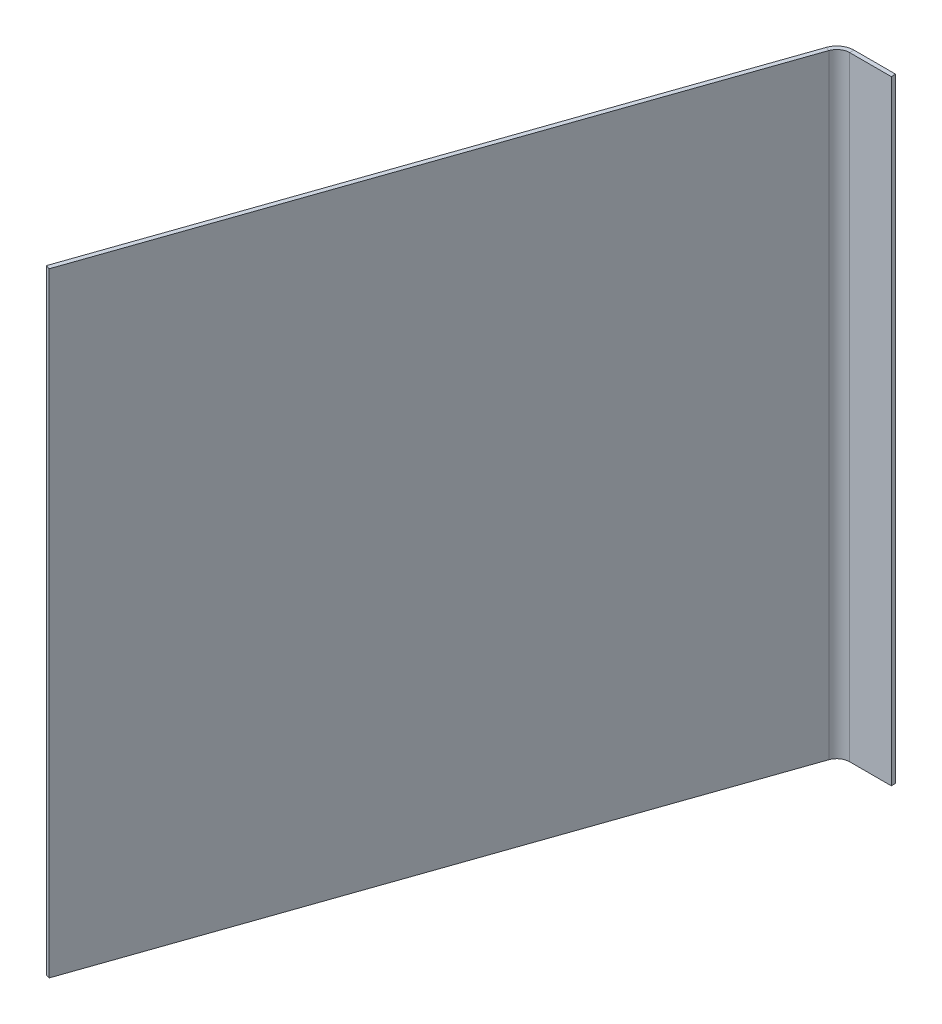
ISO-10303-21;
HEADER;
FILE_DESCRIPTION(('STEP AP214'),'2;1');
FILE_NAME('part.step','',(''),(''),'','','');
FILE_SCHEMA(('AUTOMOTIVE_DESIGN { 1 0 10303 214 1 1 1 1 }'));
ENDSEC;
DATA;
#1=APPLICATION_CONTEXT('core data for automotive mechanical design processes');
#2=APPLICATION_PROTOCOL_DEFINITION('international standard','automotive_design',2000,#1);
#3=PRODUCT_CONTEXT('',#1,'mechanical');
#4=PRODUCT('Part','Part','',(#3));
#5=PRODUCT_RELATED_PRODUCT_CATEGORY('part','',(#4));
#6=PRODUCT_DEFINITION_FORMATION('','',#4);
#7=PRODUCT_DEFINITION_CONTEXT('part definition',#1,'design');
#8=PRODUCT_DEFINITION('design','',#6,#7);
#9=PRODUCT_DEFINITION_SHAPE('','',#8);
#10=(LENGTH_UNIT() NAMED_UNIT(*) SI_UNIT(.MILLI.,.METRE.));
#11=(NAMED_UNIT(*) PLANE_ANGLE_UNIT() SI_UNIT($,.RADIAN.));
#12=(NAMED_UNIT(*) SI_UNIT($,.STERADIAN.) SOLID_ANGLE_UNIT());
#13=UNCERTAINTY_MEASURE_WITH_UNIT(LENGTH_MEASURE(1.E-05),#10,'distance_accuracy_value','');
#14=(GEOMETRIC_REPRESENTATION_CONTEXT(3) GLOBAL_UNCERTAINTY_ASSIGNED_CONTEXT((#13)) GLOBAL_UNIT_ASSIGNED_CONTEXT((#10,
#11,#12)) REPRESENTATION_CONTEXT('',''));
#15=CARTESIAN_POINT('',(0.,0.,0.));
#16=DIRECTION('',(0.,0.,1.));
#17=DIRECTION('',(1.,0.,0.));
#18=AXIS2_PLACEMENT_3D('',#15,#16,#17);
#19=CARTESIAN_POINT('',(46.0338007866481,285.,-201.623025639547));
#20=DIRECTION('',(0.,1.,0.));
#21=DIRECTION('',(0.,0.,1.));
#22=AXIS2_PLACEMENT_3D('',#19,#20,#21);
#23=PLANE('',#22);
#24=DIRECTION('',(0.,0.,1.));
#25=VECTOR('',#24,1.);
#26=CARTESIAN_POINT('',(46.0338007866481,285.,-201.623025639547));
#27=LINE('',#26,#25);
#28=CARTESIAN_POINT('',(46.0338007866481,285.,-201.623025639547));
#29=VERTEX_POINT('',#28);
#30=CARTESIAN_POINT('',(46.0338007866481,285.,-199.623025639547));
#31=VERTEX_POINT('',#30);
#32=EDGE_CURVE('E11',#29,#31,#27,.T.);
#33=ORIENTED_EDGE('',*,*,#32,.F.);
#34=CARTESIAN_POINT('',(46.0338007866481,285.,-193.623025639546));
#35=DIRECTION('',(0.,1.,0.));
#36=DIRECTION('',(0.,0.,1.));
#37=AXIS2_PLACEMENT_3D('',#34,#35,#36);
#38=CIRCLE('',#37,8.);
#39=CARTESIAN_POINT('',(38.4759660145645,285.,-196.245835880087));
#40=VERTEX_POINT('',#39);
#41=EDGE_CURVE('E143',#40,#29,#38,.F.);
#42=ORIENTED_EDGE('',*,*,#41,.F.);
#43=DIRECTION('',(-0.944729346510452,0.,-0.327851280067556));
#44=VECTOR('',#43,1.);
#45=CARTESIAN_POINT('',(40.3654247075854,285.,-195.590133319952));
#46=LINE('',#45,#44);
#47=CARTESIAN_POINT('',(40.3654247075854,285.,-195.590133319952));
#48=VERTEX_POINT('',#47);
#49=EDGE_CURVE('E49',#48,#40,#46,.T.);
#50=ORIENTED_EDGE('',*,*,#49,.F.);
#51=CARTESIAN_POINT('',(46.0338007866481,285.,-193.623025639546));
#52=DIRECTION('',(0.,1.,0.));
#53=DIRECTION('',(1.,0.,0.));
#54=AXIS2_PLACEMENT_3D('',#51,#52,#53);
#55=CIRCLE('',#54,6.);
#56=EDGE_CURVE('E133',#48,#31,#55,.F.);
#57=ORIENTED_EDGE('',*,*,#56,.T.);
#58=EDGE_LOOP('',(#33,#42,#50,#57));
#59=FACE_BOUND('',#58,.T.);
#60=ADVANCED_FACE('F40',(#59),#23,.T.);
#61=CARTESIAN_POINT('',(40.3654247075854,285.,-195.590133319952));
#62=DIRECTION('',(0.,1.,0.));
#63=DIRECTION('',(0.,0.,1.));
#64=AXIS2_PLACEMENT_3D('',#61,#62,#63);
#65=PLANE('',#64);
#66=DIRECTION('',(1.,0.,0.));
#67=VECTOR('',#66,1.);
#68=CARTESIAN_POINT('',(40.3420227347422,285.,-201.623025639547));
#69=LINE('',#68,#67);
#70=CARTESIAN_POINT('',(65.3420227347423,285.,-201.623025639547));
#71=VERTEX_POINT('',#70);
#72=EDGE_CURVE('E213',#29,#71,#69,.T.);
#73=ORIENTED_EDGE('',*,*,#72,.F.);
#74=ORIENTED_EDGE('',*,*,#32,.T.);
#75=DIRECTION('',(1.,0.,0.));
#76=VECTOR('',#75,1.);
#77=CARTESIAN_POINT('',(40.3420227347423,285.,-199.623025639546));
#78=LINE('',#77,#76);
#79=CARTESIAN_POINT('',(65.3420227347423,285.,-199.623025639547));
#80=VERTEX_POINT('',#79);
#81=EDGE_CURVE('E97',#31,#80,#78,.T.);
#82=ORIENTED_EDGE('',*,*,#81,.T.);
#83=DIRECTION('',(0.,0.,1.));
#84=VECTOR('',#83,1.);
#85=CARTESIAN_POINT('',(65.3420227347423,285.,-201.623025639547));
#86=LINE('',#85,#84);
#87=EDGE_CURVE('E399',#71,#80,#86,.T.);
#88=ORIENTED_EDGE('',*,*,#87,.F.);
#89=EDGE_LOOP('',(#73,#74,#82,#88));
#90=FACE_BOUND('',#89,.T.);
#91=ADVANCED_FACE('F221',(#90),#65,.T.);
#92=CARTESIAN_POINT('',(38.4759660145645,0.,-196.245835880087));
#93=DIRECTION('',(0.,-1.,0.));
#94=DIRECTION('',(0.,0.,-1.));
#95=AXIS2_PLACEMENT_3D('',#92,#93,#94);
#96=PLANE('',#95);
#97=DIRECTION('',(0.944729346510452,0.,0.327851280067556));
#98=VECTOR('',#97,1.);
#99=CARTESIAN_POINT('',(38.4759660145645,0.,-196.245835880087));
#100=LINE('',#99,#98);
#101=CARTESIAN_POINT('',(38.4759660145645,0.,-196.245835880087));
#102=VERTEX_POINT('',#101);
#103=CARTESIAN_POINT('',(40.3654247075854,0.,-195.590133319952));
#104=VERTEX_POINT('',#103);
#105=EDGE_CURVE('E84',#102,#104,#100,.T.);
#106=ORIENTED_EDGE('',*,*,#105,.F.);
#107=CARTESIAN_POINT('',(46.0338007866481,0.,-193.623025639547));
#108=DIRECTION('',(0.,1.,0.));
#109=DIRECTION('',(0.,0.,1.));
#110=AXIS2_PLACEMENT_3D('',#107,#108,#109);
#111=CIRCLE('',#110,8.);
#112=CARTESIAN_POINT('',(46.0338007866481,0.,-201.623025639547));
#113=VERTEX_POINT('',#112);
#114=EDGE_CURVE('E162',#102,#113,#111,.F.);
#115=ORIENTED_EDGE('',*,*,#114,.T.);
#116=DIRECTION('',(0.,0.,-1.));
#117=VECTOR('',#116,1.);
#118=CARTESIAN_POINT('',(46.0338007866481,0.,-199.623025639547));
#119=LINE('',#118,#117);
#120=CARTESIAN_POINT('',(46.0338007866481,0.,-199.623025639547));
#121=VERTEX_POINT('',#120);
#122=EDGE_CURVE('E91',#121,#113,#119,.T.);
#123=ORIENTED_EDGE('',*,*,#122,.F.);
#124=CARTESIAN_POINT('',(46.0338007866481,0.,-193.623025639547));
#125=DIRECTION('',(0.,1.,0.));
#126=DIRECTION('',(1.,0.,0.));
#127=AXIS2_PLACEMENT_3D('',#124,#125,#126);
#128=CIRCLE('',#127,6.);
#129=EDGE_CURVE('E173',#104,#121,#128,.F.);
#130=ORIENTED_EDGE('',*,*,#129,.F.);
#131=EDGE_LOOP('',(#106,#115,#123,#130));
#132=FACE_BOUND('',#131,.T.);
#133=ADVANCED_FACE('F219',(#132),#96,.T.);
#134=CARTESIAN_POINT('',(46.0338007866481,0.,-199.623025639547));
#135=DIRECTION('',(0.,-1.,0.));
#136=DIRECTION('',(0.,0.,-1.));
#137=AXIS2_PLACEMENT_3D('',#134,#135,#136);
#138=PLANE('',#137);
#139=DIRECTION('',(0.327851280067554,0.,-0.944729346510452));
#140=VECTOR('',#139,1.);
#141=CARTESIAN_POINT('',(-54.7348484848486,0.,72.3484848484841));
#142=LINE('',#141,#140);
#143=CARTESIAN_POINT('',(-54.7348484848486,0.,72.3484848484841));
#144=VERTEX_POINT('',#143);
#145=EDGE_CURVE('E165',#144,#102,#142,.T.);
#146=ORIENTED_EDGE('',*,*,#145,.T.);
#147=ORIENTED_EDGE('',*,*,#105,.T.);
#148=DIRECTION('',(0.327851280067554,0.,-0.944729346510452));
#149=VECTOR('',#148,1.);
#150=CARTESIAN_POINT('',(-52.8453897918276,0.,73.0041874086189));
#151=LINE('',#150,#149);
#152=CARTESIAN_POINT('',(-52.8453897918276,0.,73.0041874086189));
#153=VERTEX_POINT('',#152);
#154=EDGE_CURVE('E170',#153,#104,#151,.T.);
#155=ORIENTED_EDGE('',*,*,#154,.F.);
#156=DIRECTION('',(-0.944729346510452,0.,-0.327851280067556));
#157=VECTOR('',#156,1.);
#158=CARTESIAN_POINT('',(-52.8453897918276,0.,73.0041874086189));
#159=LINE('',#158,#157);
#160=EDGE_CURVE('E119',#153,#144,#159,.T.);
#161=ORIENTED_EDGE('',*,*,#160,.T.);
#162=EDGE_LOOP('',(#146,#147,#155,#161));
#163=FACE_BOUND('',#162,.T.);
#164=ADVANCED_FACE('F215',(#163),#138,.T.);
#165=CARTESIAN_POINT('',(40.3420227347423,285.,-199.623025639546));
#166=DIRECTION('',(0.,0.,-1.));
#167=DIRECTION('',(-1.,0.,0.));
#168=AXIS2_PLACEMENT_3D('',#165,#166,#167);
#169=PLANE('',#168);
#170=DIRECTION('',(1.,0.,0.));
#171=VECTOR('',#170,1.);
#172=CARTESIAN_POINT('',(40.3420227347422,0.,-199.623025639546));
#173=LINE('',#172,#171);
#174=CARTESIAN_POINT('',(65.3420227347423,0.,-199.623025639547));
#175=VERTEX_POINT('',#174);
#176=EDGE_CURVE('E150',#121,#175,#173,.T.);
#177=ORIENTED_EDGE('',*,*,#176,.T.);
#178=DIRECTION('',(0.,-1.,0.));
#179=VECTOR('',#178,1.);
#180=CARTESIAN_POINT('',(65.3420227347423,285.,-199.623025639547));
#181=LINE('',#180,#179);
#182=EDGE_CURVE('E194',#80,#175,#181,.T.);
#183=ORIENTED_EDGE('',*,*,#182,.F.);
#184=ORIENTED_EDGE('',*,*,#81,.F.);
#185=DIRECTION('',(0.,-1.,0.));
#186=VECTOR('',#185,1.);
#187=CARTESIAN_POINT('',(46.0338007866481,285.,-199.623025639547));
#188=LINE('',#187,#186);
#189=EDGE_CURVE('E149',#31,#121,#188,.T.);
#190=ORIENTED_EDGE('',*,*,#189,.T.);
#191=EDGE_LOOP('',(#177,#183,#184,#190));
#192=FACE_BOUND('',#191,.T.);
#193=ADVANCED_FACE('F227',(#192),#169,.F.);
#194=CARTESIAN_POINT('',(65.3420227347423,285.,-201.623025639547));
#195=DIRECTION('',(1.,0.,0.));
#196=DIRECTION('',(0.,0.,-1.));
#197=AXIS2_PLACEMENT_3D('',#194,#195,#196);
#198=PLANE('',#197);
#199=DIRECTION('',(0.,0.,1.));
#200=VECTOR('',#199,1.);
#201=CARTESIAN_POINT('',(65.3420227347422,0.,-201.623025639547));
#202=LINE('',#201,#200);
#203=CARTESIAN_POINT('',(65.3420227347422,0.,-201.623025639547));
#204=VERTEX_POINT('',#203);
#205=EDGE_CURVE('E154',#204,#175,#202,.T.);
#206=ORIENTED_EDGE('',*,*,#205,.F.);
#207=DIRECTION('',(0.,-1.,0.));
#208=VECTOR('',#207,1.);
#209=CARTESIAN_POINT('',(65.3420227347423,285.,-201.623025639547));
#210=LINE('',#209,#208);
#211=EDGE_CURVE('E191',#71,#204,#210,.T.);
#212=ORIENTED_EDGE('',*,*,#211,.F.);
#213=ORIENTED_EDGE('',*,*,#87,.T.);
#214=ORIENTED_EDGE('',*,*,#182,.T.);
#215=EDGE_LOOP('',(#206,#212,#213,#214));
#216=FACE_BOUND('',#215,.T.);
#217=ADVANCED_FACE('F255',(#216),#198,.T.);
#218=CARTESIAN_POINT('',(40.3420227347422,285.,-201.623025639547));
#219=DIRECTION('',(0.,0.,-1.));
#220=DIRECTION('',(-1.,0.,0.));
#221=AXIS2_PLACEMENT_3D('',#218,#219,#220);
#222=PLANE('',#221);
#223=DIRECTION('',(1.,0.,0.));
#224=VECTOR('',#223,1.);
#225=CARTESIAN_POINT('',(40.3420227347422,0.,-201.623025639547));
#226=LINE('',#225,#224);
#227=EDGE_CURVE('E158',#113,#204,#226,.T.);
#228=ORIENTED_EDGE('',*,*,#227,.F.);
#229=DIRECTION('',(0.,-1.,0.));
#230=VECTOR('',#229,1.);
#231=CARTESIAN_POINT('',(46.0338007866481,285.,-201.623025639547));
#232=LINE('',#231,#230);
#233=EDGE_CURVE('E187',#29,#113,#232,.T.);
#234=ORIENTED_EDGE('',*,*,#233,.F.);
#235=ORIENTED_EDGE('',*,*,#72,.T.);
#236=ORIENTED_EDGE('',*,*,#211,.T.);
#237=EDGE_LOOP('',(#228,#234,#235,#236));
#238=FACE_BOUND('',#237,.T.);
#239=ADVANCED_FACE('F265',(#238),#222,.T.);
#240=CARTESIAN_POINT('',(46.0338007866481,285.,-193.623025639546));
#241=DIRECTION('',(0.,-1.,0.));
#242=DIRECTION('',(0.,0.,-1.));
#243=AXIS2_PLACEMENT_3D('',#240,#241,#242);
#244=CYLINDRICAL_SURFACE('',#243,8.);
#245=ORIENTED_EDGE('',*,*,#114,.F.);
#246=DIRECTION('',(0.,-1.,0.));
#247=VECTOR('',#246,1.);
#248=CARTESIAN_POINT('',(38.4759660145645,285.,-196.245835880087));
#249=LINE('',#248,#247);
#250=EDGE_CURVE('E183',#40,#102,#249,.T.);
#251=ORIENTED_EDGE('',*,*,#250,.F.);
#252=ORIENTED_EDGE('',*,*,#41,.T.);
#253=ORIENTED_EDGE('',*,*,#233,.T.);
#254=EDGE_LOOP('',(#245,#251,#252,#253));
#255=FACE_BOUND('',#254,.T.);
#256=ADVANCED_FACE('F208',(#255),#244,.T.);
#257=CARTESIAN_POINT('',(-54.7348484848486,285.,72.3484848484839));
#258=DIRECTION('',(-0.944729346510452,0.,-0.327851280067554));
#259=DIRECTION('',(-0.327851280067554,0.,0.944729346510452));
#260=AXIS2_PLACEMENT_3D('',#257,#258,#259);
#261=PLANE('',#260);
#262=ORIENTED_EDGE('',*,*,#145,.F.);
#263=DIRECTION('',(0.,-1.,0.));
#264=VECTOR('',#263,1.);
#265=CARTESIAN_POINT('',(-54.7348484848486,285.,72.3484848484839));
#266=LINE('',#265,#264);
#267=CARTESIAN_POINT('',(-54.7348484848486,285.,72.3484848484839));
#268=VERTEX_POINT('',#267);
#269=EDGE_CURVE('E122',#268,#144,#266,.T.);
#270=ORIENTED_EDGE('',*,*,#269,.F.);
#271=DIRECTION('',(0.327851280067554,0.,-0.944729346510452));
#272=VECTOR('',#271,1.);
#273=CARTESIAN_POINT('',(-54.7348484848486,285.,72.3484848484839));
#274=LINE('',#273,#272);
#275=EDGE_CURVE('E138',#268,#40,#274,.T.);
#276=ORIENTED_EDGE('',*,*,#275,.T.);
#277=ORIENTED_EDGE('',*,*,#250,.T.);
#278=EDGE_LOOP('',(#262,#270,#276,#277));
#279=FACE_BOUND('',#278,.T.);
#280=ADVANCED_FACE('F214',(#279),#261,.T.);
#281=CARTESIAN_POINT('',(-52.8453897918277,285.,73.0041874086203));
#282=DIRECTION('',(-0.327851280067556,0.,0.944729346510452));
#283=DIRECTION('',(0.944729346510452,0.,0.327851280067556));
#284=AXIS2_PLACEMENT_3D('',#281,#282,#283);
#285=PLANE('',#284);
#286=ORIENTED_EDGE('',*,*,#160,.F.);
#287=DIRECTION('',(0.,-1.,0.));
#288=VECTOR('',#287,1.);
#289=CARTESIAN_POINT('',(-52.8453897918277,285.,73.0041874086203));
#290=LINE('',#289,#288);
#291=CARTESIAN_POINT('',(-52.8453897918277,285.,73.0041874086203));
#292=VERTEX_POINT('',#291);
#293=EDGE_CURVE('E113',#292,#153,#290,.T.);
#294=ORIENTED_EDGE('',*,*,#293,.F.);
#295=DIRECTION('',(-0.944729346510452,0.,-0.327851280067556));
#296=VECTOR('',#295,1.);
#297=CARTESIAN_POINT('',(-52.8453897918277,285.,73.0041874086203));
#298=LINE('',#297,#296);
#299=EDGE_CURVE('E117',#292,#268,#298,.T.);
#300=ORIENTED_EDGE('',*,*,#299,.T.);
#301=ORIENTED_EDGE('',*,*,#269,.T.);
#302=EDGE_LOOP('',(#286,#294,#300,#301));
#303=FACE_BOUND('',#302,.T.);
#304=ADVANCED_FACE('F115',(#303),#285,.T.);
#305=CARTESIAN_POINT('',(-52.8453897918277,285.,73.0041874086203));
#306=DIRECTION('',(-0.944729346510452,0.,-0.327851280067554));
#307=DIRECTION('',(-0.327851280067554,0.,0.944729346510452));
#308=AXIS2_PLACEMENT_3D('',#305,#306,#307);
#309=PLANE('',#308);
#310=ORIENTED_EDGE('',*,*,#154,.T.);
#311=DIRECTION('',(0.,-1.,0.));
#312=VECTOR('',#311,1.);
#313=CARTESIAN_POINT('',(40.3654247075854,285.,-195.590133319952));
#314=LINE('',#313,#312);
#315=EDGE_CURVE('E123',#48,#104,#314,.T.);
#316=ORIENTED_EDGE('',*,*,#315,.F.);
#317=DIRECTION('',(0.327851280067554,0.,-0.944729346510452));
#318=VECTOR('',#317,1.);
#319=CARTESIAN_POINT('',(-52.8453897918277,285.,73.0041874086203));
#320=LINE('',#319,#318);
#321=EDGE_CURVE('E127',#292,#48,#320,.T.);
#322=ORIENTED_EDGE('',*,*,#321,.F.);
#323=ORIENTED_EDGE('',*,*,#293,.T.);
#324=EDGE_LOOP('',(#310,#316,#322,#323));
#325=FACE_BOUND('',#324,.T.);
#326=ADVANCED_FACE('F128',(#325),#309,.F.);
#327=CARTESIAN_POINT('',(46.0338007866481,285.,-193.623025639546));
#328=DIRECTION('',(0.,-1.,0.));
#329=DIRECTION('',(0.,0.,-1.));
#330=AXIS2_PLACEMENT_3D('',#327,#328,#329);
#331=CYLINDRICAL_SURFACE('',#330,6.);
#332=ORIENTED_EDGE('',*,*,#129,.T.);
#333=ORIENTED_EDGE('',*,*,#189,.F.);
#334=ORIENTED_EDGE('',*,*,#56,.F.);
#335=ORIENTED_EDGE('',*,*,#315,.T.);
#336=EDGE_LOOP('',(#332,#333,#334,#335));
#337=FACE_BOUND('',#336,.T.);
#338=ADVANCED_FACE('F217',(#337),#331,.F.);
#339=CARTESIAN_POINT('',(46.0338007866481,285.,-193.623025639546));
#340=DIRECTION('',(0.,1.,0.));
#341=DIRECTION('',(1.,0.,0.));
#342=AXIS2_PLACEMENT_3D('',#339,#340,#341);
#343=PLANE('',#342);
#344=ORIENTED_EDGE('',*,*,#321,.T.);
#345=ORIENTED_EDGE('',*,*,#49,.T.);
#346=ORIENTED_EDGE('',*,*,#275,.F.);
#347=ORIENTED_EDGE('',*,*,#299,.F.);
#348=EDGE_LOOP('',(#344,#345,#346,#347));
#349=FACE_BOUND('',#348,.T.);
#350=ADVANCED_FACE('F136',(#349),#343,.T.);
#351=CARTESIAN_POINT('',(46.0338007866481,0.,-193.623025639547));
#352=DIRECTION('',(0.,1.,0.));
#353=DIRECTION('',(1.,0.,0.));
#354=AXIS2_PLACEMENT_3D('',#351,#352,#353);
#355=PLANE('',#354);
#356=ORIENTED_EDGE('',*,*,#176,.F.);
#357=ORIENTED_EDGE('',*,*,#122,.T.);
#358=ORIENTED_EDGE('',*,*,#227,.T.);
#359=ORIENTED_EDGE('',*,*,#205,.T.);
#360=EDGE_LOOP('',(#356,#357,#358,#359));
#361=FACE_BOUND('',#360,.T.);
#362=ADVANCED_FACE('F324',(#361),#355,.F.);
#363=CLOSED_SHELL('',(#60,#91,#133,#164,#193,#217,#239,#256,#280,#304,#326,#338,#350,#362));
#364=MANIFOLD_SOLID_BREP('B2',#363);
#365=ADVANCED_BREP_SHAPE_REPRESENTATION('',(#18,#364),#14);
#366=SHAPE_DEFINITION_REPRESENTATION(#9,#365);
ENDSEC;
END-ISO-10303-21;
